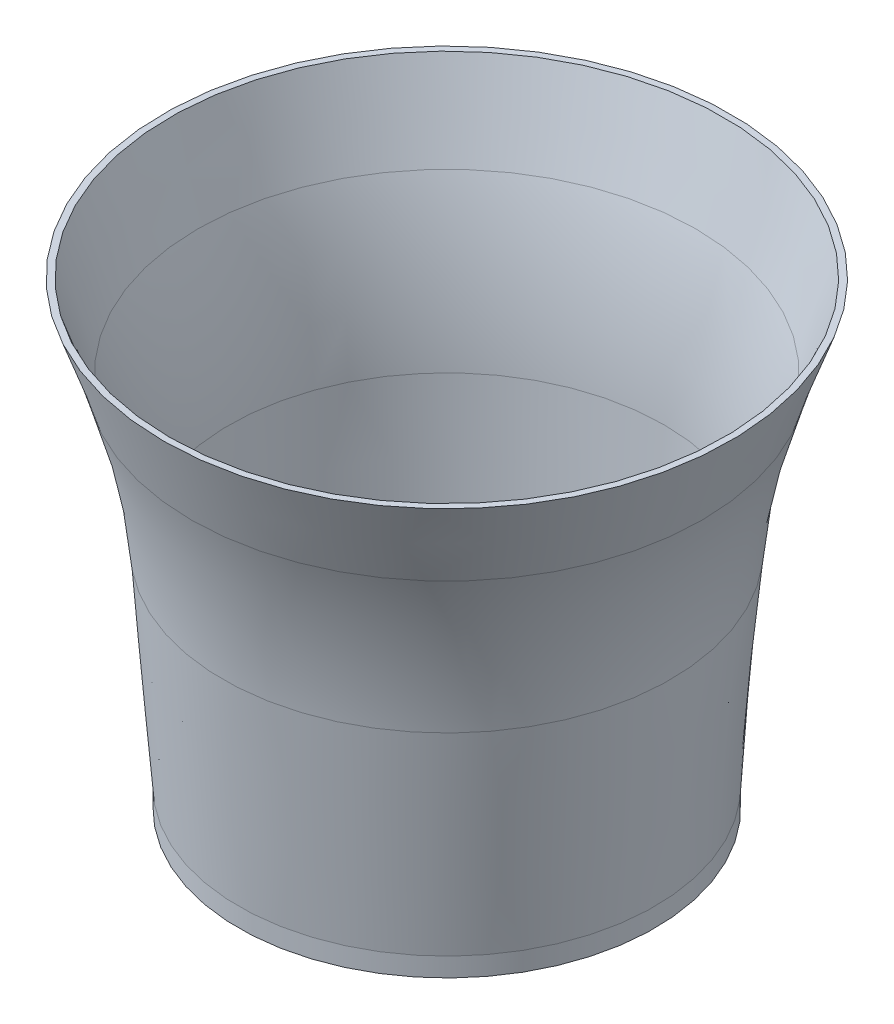
ISO-10303-21;
HEADER;
FILE_DESCRIPTION(('STEP AP214'),'2;1');
FILE_NAME('part.step','',(''),(''),'','','');
FILE_SCHEMA(('AUTOMOTIVE_DESIGN { 1 0 10303 214 1 1 1 1 }'));
ENDSEC;
DATA;
#1=APPLICATION_CONTEXT('core data for automotive mechanical design processes');
#2=APPLICATION_PROTOCOL_DEFINITION('international standard','automotive_design',2000,#1);
#3=PRODUCT_CONTEXT('',#1,'mechanical');
#4=PRODUCT('Part','Part','',(#3));
#5=PRODUCT_RELATED_PRODUCT_CATEGORY('part','',(#4));
#6=PRODUCT_DEFINITION_FORMATION('','',#4);
#7=PRODUCT_DEFINITION_CONTEXT('part definition',#1,'design');
#8=PRODUCT_DEFINITION('design','',#6,#7);
#9=PRODUCT_DEFINITION_SHAPE('','',#8);
#10=(LENGTH_UNIT() NAMED_UNIT(*) SI_UNIT(.MILLI.,.METRE.));
#11=(NAMED_UNIT(*) PLANE_ANGLE_UNIT() SI_UNIT($,.RADIAN.));
#12=(NAMED_UNIT(*) SI_UNIT($,.STERADIAN.) SOLID_ANGLE_UNIT());
#13=UNCERTAINTY_MEASURE_WITH_UNIT(LENGTH_MEASURE(1.E-05),#10,'distance_accuracy_value','');
#14=(GEOMETRIC_REPRESENTATION_CONTEXT(3) GLOBAL_UNCERTAINTY_ASSIGNED_CONTEXT((#13)) GLOBAL_UNIT_ASSIGNED_CONTEXT((#10,
#11,#12)) REPRESENTATION_CONTEXT('',''));
#15=CARTESIAN_POINT('',(0.,0.,0.));
#16=DIRECTION('',(0.,0.,1.));
#17=DIRECTION('',(1.,0.,0.));
#18=AXIS2_PLACEMENT_3D('',#15,#16,#17);
#19=CARTESIAN_POINT('',(0.,-3.,10.));
#20=DIRECTION('',(0.,1.,0.));
#21=DIRECTION('',(0.,0.,1.));
#22=AXIS2_PLACEMENT_3D('',#19,#20,#21);
#23=CYLINDRICAL_SURFACE('',#22,2.);
#24=CARTESIAN_POINT('',(0.,-3.,10.));
#25=DIRECTION('',(0.,-1.,0.));
#26=DIRECTION('',(0.,0.,-1.));
#27=AXIS2_PLACEMENT_3D('',#24,#25,#26);
#28=CIRCLE('',#27,2.);
#29=CARTESIAN_POINT('',(0.,-3.,8.));
#30=VERTEX_POINT('',#29);
#31=EDGE_CURVE('E279',#30,#30,#28,.T.);
#32=ORIENTED_EDGE('',*,*,#31,.T.);
#33=EDGE_LOOP('',(#32));
#34=FACE_BOUND('',#33,.T.);
#35=CARTESIAN_POINT('',(0.,2.,10.));
#36=DIRECTION('',(0.,1.,0.));
#37=DIRECTION('',(0.,0.,1.));
#38=AXIS2_PLACEMENT_3D('',#35,#36,#37);
#39=CIRCLE('',#38,2.);
#40=CARTESIAN_POINT('',(0.,2.,12.));
#41=VERTEX_POINT('',#40);
#42=EDGE_CURVE('E43',#41,#41,#39,.T.);
#43=ORIENTED_EDGE('',*,*,#42,.T.);
#44=EDGE_LOOP('',(#43));
#45=FACE_BOUND('',#44,.T.);
#46=ADVANCED_FACE('F39',(#34,#45),#23,.F.);
#47=CARTESIAN_POINT('',(0.,-3.,-5.));
#48=DIRECTION('',(0.,1.,0.));
#49=DIRECTION('',(0.,0.,1.));
#50=AXIS2_PLACEMENT_3D('',#47,#48,#49);
#51=CYLINDRICAL_SURFACE('',#50,2.);
#52=CARTESIAN_POINT('',(0.,-3.,-5.));
#53=DIRECTION('',(0.,-1.,0.));
#54=DIRECTION('',(0.,0.,-1.));
#55=AXIS2_PLACEMENT_3D('',#52,#53,#54);
#56=CIRCLE('',#55,2.);
#57=CARTESIAN_POINT('',(0.,-3.,-7.));
#58=VERTEX_POINT('',#57);
#59=EDGE_CURVE('E274',#58,#58,#56,.T.);
#60=ORIENTED_EDGE('',*,*,#59,.T.);
#61=EDGE_LOOP('',(#60));
#62=FACE_BOUND('',#61,.T.);
#63=CARTESIAN_POINT('',(0.,2.,-5.));
#64=DIRECTION('',(0.,1.,0.));
#65=DIRECTION('',(0.,0.,1.));
#66=AXIS2_PLACEMENT_3D('',#63,#64,#65);
#67=CIRCLE('',#66,2.);
#68=CARTESIAN_POINT('',(0.,2.,-3.));
#69=VERTEX_POINT('',#68);
#70=EDGE_CURVE('E171',#69,#69,#67,.T.);
#71=ORIENTED_EDGE('',*,*,#70,.T.);
#72=EDGE_LOOP('',(#71));
#73=FACE_BOUND('',#72,.T.);
#74=ADVANCED_FACE('F263',(#62,#73),#51,.F.);
#75=CARTESIAN_POINT('',(0.,0.,0.));
#76=DIRECTION('',(0.,-1.,0.));
#77=DIRECTION('',(0.,0.,-1.));
#78=AXIS2_PLACEMENT_3D('',#75,#76,#77);
#79=PLANE('',#78);
#80=CARTESIAN_POINT('',(0.,0.,0.));
#81=DIRECTION('',(0.,-1.,0.));
#82=DIRECTION('',(0.,0.,-1.));
#83=AXIS2_PLACEMENT_3D('',#80,#81,#82);
#84=CIRCLE('',#83,32.);
#85=CARTESIAN_POINT('',(0.,0.,-32.));
#86=VERTEX_POINT('',#85);
#87=CARTESIAN_POINT('',(32.,0.,-9.05575832015686E-13));
#88=VERTEX_POINT('',#87);
#89=EDGE_CURVE('E290',#86,#88,#84,.T.);
#90=ORIENTED_EDGE('',*,*,#89,.F.);
#91=CARTESIAN_POINT('',(0.,0.,-29.6591143121495));
#92=DIRECTION('',(0.,-1.,0.));
#93=DIRECTION('',(0.,0.,-1.));
#94=AXIS2_PLACEMENT_3D('',#91,#92,#93);
#95=CIRCLE('',#94,2.34088568784921);
#96=CARTESIAN_POINT('',(0.870766699667161,0.,-27.4862104582416));
#97=VERTEX_POINT('',#96);
#98=EDGE_CURVE('E224',#86,#97,#95,.T.);
#99=ORIENTED_EDGE('',*,*,#98,.T.);
#100=CARTESIAN_POINT('',(0.,0.,0.));
#101=DIRECTION('',(0.,-1.,0.));
#102=DIRECTION('',(0.,0.,-1.));
#103=AXIS2_PLACEMENT_3D('',#100,#101,#102);
#104=CIRCLE('',#103,27.5);
#105=CARTESIAN_POINT('',(27.4862104582416,0.,-0.870766699667734));
#106=VERTEX_POINT('',#105);
#107=EDGE_CURVE('E138',#97,#106,#104,.T.);
#108=ORIENTED_EDGE('',*,*,#107,.T.);
#109=CARTESIAN_POINT('',(29.6591143121504,0.,-8.39330535002309E-13));
#110=DIRECTION('',(0.,-1.,0.));
#111=DIRECTION('',(0.,0.,-1.));
#112=AXIS2_PLACEMENT_3D('',#109,#110,#111);
#113=CIRCLE('',#112,2.34088568784986);
#114=EDGE_CURVE('E216',#106,#88,#113,.T.);
#115=ORIENTED_EDGE('',*,*,#114,.T.);
#116=EDGE_LOOP('',(#90,#99,#108,#115));
#117=FACE_BOUND('',#116,.T.);
#118=ADVANCED_FACE('F323',(#117),#79,.F.);
#119=CARTESIAN_POINT('',(1.81115166403142E-12,0.,32.));
#120=VERTEX_POINT('',#119);
#121=EDGE_CURVE('E293',#88,#120,#84,.T.);
#122=ORIENTED_EDGE('',*,*,#121,.F.);
#123=CARTESIAN_POINT('',(27.4862104582416,0.,0.870766699666174));
#124=VERTEX_POINT('',#123);
#125=EDGE_CURVE('E219',#88,#124,#113,.T.);
#126=ORIENTED_EDGE('',*,*,#125,.T.);
#127=CARTESIAN_POINT('',(0.870766699673302,0.,27.4862104582414));
#128=VERTEX_POINT('',#127);
#129=EDGE_CURVE('E143',#124,#128,#104,.T.);
#130=ORIENTED_EDGE('',*,*,#129,.T.);
#131=CARTESIAN_POINT('',(1.67866107000462E-12,0.,29.6591143121495));
#132=DIRECTION('',(0.,-1.,0.));
#133=DIRECTION('',(0.,0.,-1.));
#134=AXIS2_PLACEMENT_3D('',#131,#132,#133);
#135=CIRCLE('',#134,2.34088568785101);
#136=EDGE_CURVE('E212',#128,#120,#135,.T.);
#137=ORIENTED_EDGE('',*,*,#136,.T.);
#138=EDGE_LOOP('',(#122,#126,#130,#137));
#139=FACE_BOUND('',#138,.T.);
#140=ADVANCED_FACE('F471',(#139),#79,.F.);
#141=CARTESIAN_POINT('',(-27.4862104582415,0.,-0.870766699671817));
#142=VERTEX_POINT('',#141);
#143=CARTESIAN_POINT('',(-0.870766699667165,0.,-27.4862104582416));
#144=VERTEX_POINT('',#143);
#145=EDGE_CURVE('E132',#142,#144,#104,.T.);
#146=ORIENTED_EDGE('',*,*,#145,.T.);
#147=EDGE_CURVE('E222',#144,#86,#95,.T.);
#148=ORIENTED_EDGE('',*,*,#147,.T.);
#149=CARTESIAN_POINT('',(-32.,0.,9.09494701773009E-13));
#150=VERTEX_POINT('',#149);
#151=EDGE_CURVE('E285',#150,#86,#84,.T.);
#152=ORIENTED_EDGE('',*,*,#151,.F.);
#153=CARTESIAN_POINT('',(-29.6591143121487,0.,8.42962728943101E-13));
#154=DIRECTION('',(0.,-1.,0.));
#155=DIRECTION('',(0.,0.,-1.));
#156=AXIS2_PLACEMENT_3D('',#153,#154,#155);
#157=CIRCLE('',#156,2.34088568785055);
#158=EDGE_CURVE('E133',#150,#142,#157,.T.);
#159=ORIENTED_EDGE('',*,*,#158,.T.);
#160=EDGE_LOOP('',(#146,#148,#152,#159));
#161=FACE_BOUND('',#160,.T.);
#162=ADVANCED_FACE('F336',(#161),#79,.F.);
#163=CARTESIAN_POINT('',(0.,5.,0.));
#164=DIRECTION('',(0.,-1.,0.));
#165=DIRECTION('',(0.,0.,-1.));
#166=AXIS2_PLACEMENT_3D('',#163,#164,#165);
#167=CYLINDRICAL_SURFACE('',#166,27.5);
#168=DIRECTION('',(0.,1.,0.));
#169=VECTOR('',#168,1.);
#170=CARTESIAN_POINT('',(0.870766699667159,33.50005,-27.4862104582416));
#171=LINE('',#170,#169);
#172=CARTESIAN_POINT('',(0.87076669966714,5.,-27.4862104582416));
#173=VERTEX_POINT('',#172);
#174=EDGE_CURVE('E221',#173,#97,#171,.F.);
#175=ORIENTED_EDGE('',*,*,#174,.F.);
#176=CARTESIAN_POINT('',(0.,5.,0.));
#177=DIRECTION('',(0.,-1.,0.));
#178=DIRECTION('',(0.,0.,-1.));
#179=AXIS2_PLACEMENT_3D('',#176,#177,#178);
#180=CIRCLE('',#179,27.5);
#181=CARTESIAN_POINT('',(27.4862104582416,5.,-0.870766699667731));
#182=VERTEX_POINT('',#181);
#183=EDGE_CURVE('E140',#173,#182,#180,.T.);
#184=ORIENTED_EDGE('',*,*,#183,.T.);
#185=DIRECTION('',(0.,1.,0.));
#186=VECTOR('',#185,1.);
#187=CARTESIAN_POINT('',(27.4862104582416,33.50005,-0.870766699667733));
#188=LINE('',#187,#186);
#189=EDGE_CURVE('E213',#106,#182,#188,.T.);
#190=ORIENTED_EDGE('',*,*,#189,.F.);
#191=ORIENTED_EDGE('',*,*,#107,.F.);
#192=EDGE_LOOP('',(#175,#184,#190,#191));
#193=FACE_BOUND('',#192,.T.);
#194=ADVANCED_FACE('F315',(#193),#167,.T.);
#195=DIRECTION('',(0.,1.,0.));
#196=VECTOR('',#195,1.);
#197=CARTESIAN_POINT('',(27.4862104582416,33.50005,0.870766699666177));
#198=LINE('',#197,#196);
#199=CARTESIAN_POINT('',(27.4862104582417,5.,0.870766699666175));
#200=VERTEX_POINT('',#199);
#201=EDGE_CURVE('E163',#200,#124,#198,.F.);
#202=ORIENTED_EDGE('',*,*,#201,.F.);
#203=CARTESIAN_POINT('',(0.870766699673303,5.,27.4862104582414));
#204=VERTEX_POINT('',#203);
#205=EDGE_CURVE('E141',#200,#204,#180,.T.);
#206=ORIENTED_EDGE('',*,*,#205,.T.);
#207=DIRECTION('',(0.,1.,0.));
#208=VECTOR('',#207,1.);
#209=CARTESIAN_POINT('',(0.870766699673305,33.50005,27.4862104582414));
#210=LINE('',#209,#208);
#211=EDGE_CURVE('E161',#128,#204,#210,.T.);
#212=ORIENTED_EDGE('',*,*,#211,.F.);
#213=ORIENTED_EDGE('',*,*,#129,.F.);
#214=EDGE_LOOP('',(#202,#206,#212,#213));
#215=FACE_BOUND('',#214,.T.);
#216=ADVANCED_FACE('F159',(#215),#167,.T.);
#217=DIRECTION('',(0.,1.,0.));
#218=VECTOR('',#217,1.);
#219=CARTESIAN_POINT('',(-0.870766699670193,33.50005,27.4862104582415));
#220=LINE('',#219,#218);
#221=CARTESIAN_POINT('',(-0.870766699670191,5.,27.4862104582415));
#222=VERTEX_POINT('',#221);
#223=CARTESIAN_POINT('',(-0.870766699670182,0.,27.4862104582415));
#224=VERTEX_POINT('',#223);
#225=EDGE_CURVE('E207',#222,#224,#220,.F.);
#226=ORIENTED_EDGE('',*,*,#225,.F.);
#227=CARTESIAN_POINT('',(-27.4862104582414,5.,0.8707666996734));
#228=VERTEX_POINT('',#227);
#229=EDGE_CURVE('E137',#222,#228,#180,.T.);
#230=ORIENTED_EDGE('',*,*,#229,.T.);
#231=DIRECTION('',(0.,1.,0.));
#232=VECTOR('',#231,1.);
#233=CARTESIAN_POINT('',(-27.4862104582414,33.50005,0.870766699673392));
#234=LINE('',#233,#232);
#235=CARTESIAN_POINT('',(-27.4862104582414,0.,0.870766699673389));
#236=VERTEX_POINT('',#235);
#237=EDGE_CURVE('E63',#236,#228,#234,.T.);
#238=ORIENTED_EDGE('',*,*,#237,.F.);
#239=EDGE_CURVE('E232',#224,#236,#104,.T.);
#240=ORIENTED_EDGE('',*,*,#239,.F.);
#241=EDGE_LOOP('',(#226,#230,#238,#240));
#242=FACE_BOUND('',#241,.T.);
#243=ADVANCED_FACE('F316',(#242),#167,.T.);
#244=CARTESIAN_POINT('',(0.,45.,0.));
#245=DIRECTION('',(0.,1.,0.));
#246=DIRECTION('',(0.,0.,1.));
#247=AXIS2_PLACEMENT_3D('',#244,#245,#246);
#248=CONICAL_SURFACE('',#247,36.5,0.0776215087373936);
#249=CARTESIAN_POINT('',(0.,32.4663971508259,0.));
#250=DIRECTION('',(0.,-1.,0.));
#251=DIRECTION('',(0.,0.,-1.));
#252=AXIS2_PLACEMENT_3D('',#249,#250,#251);
#253=CIRCLE('',#252,35.525164222842);
#254=CARTESIAN_POINT('',(0.,32.4663971508259,-35.525164222842));
#255=VERTEX_POINT('',#254);
#256=EDGE_CURVE('E124',#255,#255,#253,.T.);
#257=ORIENTED_EDGE('',*,*,#256,.T.);
#258=EDGE_LOOP('',(#257));
#259=FACE_BOUND('',#258,.T.);
#260=CARTESIAN_POINT('',(0.,0.,0.));
#261=DIRECTION('',(0.,-1.,0.));
#262=DIRECTION('',(0.,0.,-1.));
#263=AXIS2_PLACEMENT_3D('',#260,#261,#262);
#264=CIRCLE('',#263,33.);
#265=CARTESIAN_POINT('',(0.,0.,-33.));
#266=VERTEX_POINT('',#265);
#267=EDGE_CURVE('E286',#266,#266,#264,.T.);
#268=ORIENTED_EDGE('',*,*,#267,.F.);
#269=EDGE_LOOP('',(#268));
#270=FACE_BOUND('',#269,.T.);
#271=ADVANCED_FACE('F304',(#259,#270),#248,.T.);
#272=CARTESIAN_POINT('',(0.,0.,0.));
#273=DIRECTION('',(0.,1.,0.));
#274=DIRECTION('',(0.,0.,1.));
#275=AXIS2_PLACEMENT_3D('',#272,#273,#274);
#276=CONICAL_SURFACE('',#275,32.,0.0776215087373934);
#277=CARTESIAN_POINT('',(0.,32.4663971508262,0.));
#278=DIRECTION('',(0.,-1.,0.));
#279=DIRECTION('',(0.,0.,-1.));
#280=AXIS2_PLACEMENT_3D('',#277,#278,#279);
#281=CIRCLE('',#280,34.525164222842);
#282=CARTESIAN_POINT('',(0.,32.4663971508262,-34.525164222842));
#283=VERTEX_POINT('',#282);
#284=EDGE_CURVE('E289',#283,#283,#281,.F.);
#285=ORIENTED_EDGE('',*,*,#284,.T.);
#286=EDGE_LOOP('',(#285));
#287=FACE_BOUND('',#286,.T.);
#288=ORIENTED_EDGE('',*,*,#89,.T.);
#289=ORIENTED_EDGE('',*,*,#121,.T.);
#290=EDGE_CURVE('E540',#120,#150,#84,.T.);
#291=ORIENTED_EDGE('',*,*,#290,.T.);
#292=ORIENTED_EDGE('',*,*,#151,.T.);
#293=EDGE_LOOP('',(#288,#289,#291,#292));
#294=FACE_BOUND('',#293,.T.);
#295=ADVANCED_FACE('F334',(#287,#294),#276,.F.);
#296=ORIENTED_EDGE('',*,*,#290,.F.);
#297=EDGE_CURVE('E209',#120,#224,#135,.T.);
#298=ORIENTED_EDGE('',*,*,#297,.T.);
#299=ORIENTED_EDGE('',*,*,#239,.T.);
#300=EDGE_CURVE('E205',#236,#150,#157,.T.);
#301=ORIENTED_EDGE('',*,*,#300,.T.);
#302=EDGE_LOOP('',(#296,#298,#299,#301));
#303=FACE_BOUND('',#302,.T.);
#304=ADVANCED_FACE('F330',(#303),#79,.F.);
#305=CARTESIAN_POINT('',(0.,-3.,0.));
#306=DIRECTION('',(0.,-1.,0.));
#307=DIRECTION('',(0.,0.,-1.));
#308=AXIS2_PLACEMENT_3D('',#305,#306,#307);
#309=PLANE('',#308);
#310=CARTESIAN_POINT('',(0.,-3.,-29.6591143121495));
#311=DIRECTION('',(0.,1.,0.));
#312=DIRECTION('',(0.,0.,1.));
#313=AXIS2_PLACEMENT_3D('',#310,#311,#312);
#314=CIRCLE('',#313,2.34088568784921);
#315=CARTESIAN_POINT('',(0.,-3.,-27.3182286243003));
#316=VERTEX_POINT('',#315);
#317=EDGE_CURVE('E192',#316,#316,#314,.T.);
#318=ORIENTED_EDGE('',*,*,#317,.T.);
#319=EDGE_LOOP('',(#318));
#320=FACE_BOUND('',#319,.T.);
#321=CARTESIAN_POINT('',(29.6591143121504,-3.,-8.39330535002309E-13));
#322=DIRECTION('',(0.,1.,0.));
#323=DIRECTION('',(0.,0.,1.));
#324=AXIS2_PLACEMENT_3D('',#321,#322,#323);
#325=CIRCLE('',#324,2.34088568784986);
#326=CARTESIAN_POINT('',(29.6591143121504,-3.,2.34088568784902));
#327=VERTEX_POINT('',#326);
#328=EDGE_CURVE('E195',#327,#327,#325,.T.);
#329=ORIENTED_EDGE('',*,*,#328,.T.);
#330=EDGE_LOOP('',(#329));
#331=FACE_BOUND('',#330,.T.);
#332=CARTESIAN_POINT('',(1.67866107000462E-12,-3.,29.6591143121495));
#333=DIRECTION('',(0.,1.,0.));
#334=DIRECTION('',(0.,0.,1.));
#335=AXIS2_PLACEMENT_3D('',#332,#333,#334);
#336=CIRCLE('',#335,2.34088568785101);
#337=CARTESIAN_POINT('',(1.67866107000462E-12,-3.,32.0000000000005));
#338=VERTEX_POINT('',#337);
#339=EDGE_CURVE('E198',#338,#338,#336,.T.);
#340=ORIENTED_EDGE('',*,*,#339,.T.);
#341=EDGE_LOOP('',(#340));
#342=FACE_BOUND('',#341,.T.);
#343=CARTESIAN_POINT('',(-29.6591143121487,-3.,8.42962728943101E-13));
#344=DIRECTION('',(0.,1.,0.));
#345=DIRECTION('',(0.,0.,1.));
#346=AXIS2_PLACEMENT_3D('',#343,#344,#345);
#347=CIRCLE('',#346,2.34088568785055);
#348=CARTESIAN_POINT('',(-29.6591143121487,-3.,2.3408856878514));
#349=VERTEX_POINT('',#348);
#350=EDGE_CURVE('E177',#349,#349,#347,.T.);
#351=ORIENTED_EDGE('',*,*,#350,.T.);
#352=EDGE_LOOP('',(#351));
#353=FACE_BOUND('',#352,.T.);
#354=ORIENTED_EDGE('',*,*,#31,.F.);
#355=EDGE_LOOP('',(#354));
#356=FACE_BOUND('',#355,.T.);
#357=CARTESIAN_POINT('',(0.,-3.,0.));
#358=DIRECTION('',(0.,-1.,0.));
#359=DIRECTION('',(0.,0.,-1.));
#360=AXIS2_PLACEMENT_3D('',#357,#358,#359);
#361=CIRCLE('',#360,33.);
#362=CARTESIAN_POINT('',(0.,-3.,-33.));
#363=VERTEX_POINT('',#362);
#364=EDGE_CURVE('E282',#363,#363,#361,.T.);
#365=ORIENTED_EDGE('',*,*,#364,.T.);
#366=EDGE_LOOP('',(#365));
#367=FACE_BOUND('',#366,.T.);
#368=ORIENTED_EDGE('',*,*,#59,.F.);
#369=EDGE_LOOP('',(#368));
#370=FACE_BOUND('',#369,.T.);
#371=ADVANCED_FACE('F327',(#320,#331,#342,#353,#356,#367,#370),#309,.T.);
#372=CARTESIAN_POINT('',(0.,-3.,0.));
#373=DIRECTION('',(0.,1.,0.));
#374=DIRECTION('',(0.,0.,1.));
#375=AXIS2_PLACEMENT_3D('',#372,#373,#374);
#376=CYLINDRICAL_SURFACE('',#375,33.);
#377=ORIENTED_EDGE('',*,*,#364,.F.);
#378=EDGE_LOOP('',(#377));
#379=FACE_BOUND('',#378,.T.);
#380=ORIENTED_EDGE('',*,*,#267,.T.);
#381=EDGE_LOOP('',(#380));
#382=FACE_BOUND('',#381,.T.);
#383=ADVANCED_FACE('F261',(#379,#382),#376,.T.);
#384=CARTESIAN_POINT('',(0.,70.,0.));
#385=DIRECTION('',(0.,1.,0.));
#386=DIRECTION('',(0.,0.,1.));
#387=AXIS2_PLACEMENT_3D('',#384,#385,#386);
#388=PLANE('',#387);
#389=CARTESIAN_POINT('',(0.,70.,0.));
#390=DIRECTION('',(0.,1.,0.));
#391=DIRECTION('',(0.,0.,1.));
#392=AXIS2_PLACEMENT_3D('',#389,#390,#391);
#393=CIRCLE('',#392,44.);
#394=CARTESIAN_POINT('',(0.,70.,44.));
#395=VERTEX_POINT('',#394);
#396=EDGE_CURVE('E147',#395,#395,#393,.T.);
#397=ORIENTED_EDGE('',*,*,#396,.F.);
#398=EDGE_LOOP('',(#397));
#399=FACE_BOUND('',#398,.T.);
#400=CARTESIAN_POINT('',(0.,70.,0.));
#401=DIRECTION('',(0.,1.,0.));
#402=DIRECTION('',(0.,0.,1.));
#403=AXIS2_PLACEMENT_3D('',#400,#401,#402);
#404=CIRCLE('',#403,45.);
#405=CARTESIAN_POINT('',(0.,70.,45.));
#406=VERTEX_POINT('',#405);
#407=EDGE_CURVE('E152',#406,#406,#404,.T.);
#408=ORIENTED_EDGE('',*,*,#407,.T.);
#409=EDGE_LOOP('',(#408));
#410=FACE_BOUND('',#409,.T.);
#411=ADVANCED_FACE('F255',(#399,#410),#388,.T.);
#412=CARTESIAN_POINT('',(0.,45.,0.));
#413=DIRECTION('',(0.,1.,0.));
#414=DIRECTION('',(0.,0.,1.));
#415=AXIS2_PLACEMENT_3D('',#412,#413,#414);
#416=CONICAL_SURFACE('',#415,36.5,0.327738506780556);
#417=CARTESIAN_POINT('',(0.,56.9023118738769,0.));
#418=DIRECTION('',(0.,-1.,0.));
#419=DIRECTION('',(0.,0.,-1.));
#420=AXIS2_PLACEMENT_3D('',#417,#418,#419);
#421=CIRCLE('',#420,40.5467860371182);
#422=CARTESIAN_POINT('',(0.,56.9023118738769,-40.5467860371182));
#423=VERTEX_POINT('',#422);
#424=EDGE_CURVE('E299',#423,#423,#421,.F.);
#425=ORIENTED_EDGE('',*,*,#424,.T.);
#426=EDGE_LOOP('',(#425));
#427=FACE_BOUND('',#426,.T.);
#428=ORIENTED_EDGE('',*,*,#407,.F.);
#429=EDGE_LOOP('',(#428));
#430=FACE_BOUND('',#429,.T.);
#431=ADVANCED_FACE('F244',(#427,#430),#416,.T.);
#432=CARTESIAN_POINT('',(0.,45.,0.));
#433=DIRECTION('',(0.,1.,0.));
#434=DIRECTION('',(0.,0.,1.));
#435=AXIS2_PLACEMENT_3D('',#432,#433,#434);
#436=CONICAL_SURFACE('',#435,35.5,0.327738506780555);
#437=CARTESIAN_POINT('',(0.,56.9023118738771,0.));
#438=DIRECTION('',(0.,-1.,0.));
#439=DIRECTION('',(0.,0.,-1.));
#440=AXIS2_PLACEMENT_3D('',#437,#438,#439);
#441=CIRCLE('',#440,39.5467860371182);
#442=CARTESIAN_POINT('',(0.,56.9023118738771,-39.5467860371182));
#443=VERTEX_POINT('',#442);
#444=EDGE_CURVE('E296',#443,#443,#441,.T.);
#445=ORIENTED_EDGE('',*,*,#444,.T.);
#446=EDGE_LOOP('',(#445));
#447=FACE_BOUND('',#446,.T.);
#448=ORIENTED_EDGE('',*,*,#396,.T.);
#449=EDGE_LOOP('',(#448));
#450=FACE_BOUND('',#449,.T.);
#451=ADVANCED_FACE('F254',(#447,#450),#436,.F.);
#452=CARTESIAN_POINT('',(0.,24.7120385500068,0.));
#453=DIRECTION('',(0.,-1.,0.));
#454=DIRECTION('',(0.,0.,-1.));
#455=AXIS2_PLACEMENT_3D('',#452,#453,#454);
#456=TOROIDAL_SURFACE('',#455,134.224060519089,100.);
#457=ORIENTED_EDGE('',*,*,#444,.F.);
#458=EDGE_LOOP('',(#457));
#459=FACE_BOUND('',#458,.T.);
#460=ORIENTED_EDGE('',*,*,#284,.F.);
#461=EDGE_LOOP('',(#460));
#462=FACE_BOUND('',#461,.T.);
#463=ADVANCED_FACE('F309',(#459,#462),#456,.T.);
#464=CARTESIAN_POINT('',(0.,24.7120385500067,0.));
#465=DIRECTION('',(0.,1.,0.));
#466=DIRECTION('',(0.,0.,1.));
#467=AXIS2_PLACEMENT_3D('',#464,#465,#466);
#468=TOROIDAL_SURFACE('',#467,135.224060519089,100.);
#469=ORIENTED_EDGE('',*,*,#256,.F.);
#470=EDGE_LOOP('',(#469));
#471=FACE_BOUND('',#470,.T.);
#472=ORIENTED_EDGE('',*,*,#424,.F.);
#473=EDGE_LOOP('',(#472));
#474=FACE_BOUND('',#473,.T.);
#475=ADVANCED_FACE('F41',(#471,#474),#468,.F.);
#476=DIRECTION('',(0.,1.,0.));
#477=VECTOR('',#476,1.);
#478=CARTESIAN_POINT('',(-0.870766699667159,33.50005,-27.4862104582416));
#479=LINE('',#478,#477);
#480=CARTESIAN_POINT('',(-0.87076669966714,5.,-27.4862104582416));
#481=VERTEX_POINT('',#480);
#482=EDGE_CURVE('E56',#144,#481,#479,.T.);
#483=ORIENTED_EDGE('',*,*,#482,.F.);
#484=ORIENTED_EDGE('',*,*,#145,.F.);
#485=DIRECTION('',(0.,1.,0.));
#486=VECTOR('',#485,1.);
#487=CARTESIAN_POINT('',(-27.4862104582415,33.50005,-0.870766699671829));
#488=LINE('',#487,#486);
#489=CARTESIAN_POINT('',(-27.4862104582415,5.,-0.870766699671837));
#490=VERTEX_POINT('',#489);
#491=EDGE_CURVE('E117',#490,#142,#488,.F.);
#492=ORIENTED_EDGE('',*,*,#491,.F.);
#493=EDGE_CURVE('E130',#490,#481,#180,.T.);
#494=ORIENTED_EDGE('',*,*,#493,.T.);
#495=EDGE_LOOP('',(#483,#484,#492,#494));
#496=FACE_BOUND('',#495,.T.);
#497=ADVANCED_FACE('F129',(#496),#167,.T.);
#498=CARTESIAN_POINT('',(0.,5.,0.));
#499=DIRECTION('',(0.,-1.,0.));
#500=DIRECTION('',(0.,0.,-1.));
#501=AXIS2_PLACEMENT_3D('',#498,#499,#500);
#502=PLANE('',#501);
#503=CARTESIAN_POINT('',(0.,5.,-5.));
#504=DIRECTION('',(0.,1.,0.));
#505=DIRECTION('',(0.,0.,1.));
#506=AXIS2_PLACEMENT_3D('',#503,#504,#505);
#507=CIRCLE('',#506,4.);
#508=CARTESIAN_POINT('',(0.,5.,-1.));
#509=VERTEX_POINT('',#508);
#510=EDGE_CURVE('E179',#509,#509,#507,.T.);
#511=ORIENTED_EDGE('',*,*,#510,.F.);
#512=EDGE_LOOP('',(#511));
#513=FACE_BOUND('',#512,.T.);
#514=CARTESIAN_POINT('',(0.,5.,10.));
#515=DIRECTION('',(0.,1.,0.));
#516=DIRECTION('',(0.,0.,1.));
#517=AXIS2_PLACEMENT_3D('',#514,#515,#516);
#518=CIRCLE('',#517,4.);
#519=CARTESIAN_POINT('',(0.,5.,14.));
#520=VERTEX_POINT('',#519);
#521=EDGE_CURVE('E189',#520,#520,#518,.T.);
#522=ORIENTED_EDGE('',*,*,#521,.F.);
#523=EDGE_LOOP('',(#522));
#524=FACE_BOUND('',#523,.T.);
#525=ORIENTED_EDGE('',*,*,#183,.F.);
#526=CARTESIAN_POINT('',(0.,5.,-29.6591143121495));
#527=DIRECTION('',(0.,-1.,0.));
#528=DIRECTION('',(0.,0.,-1.));
#529=AXIS2_PLACEMENT_3D('',#526,#527,#528);
#530=CIRCLE('',#529,2.34088568784921);
#531=EDGE_CURVE('E12',#173,#481,#530,.T.);
#532=ORIENTED_EDGE('',*,*,#531,.T.);
#533=ORIENTED_EDGE('',*,*,#493,.F.);
#534=CARTESIAN_POINT('',(-29.6591143121487,5.,8.42962728943101E-13));
#535=DIRECTION('',(0.,-1.,0.));
#536=DIRECTION('',(0.,0.,-1.));
#537=AXIS2_PLACEMENT_3D('',#534,#535,#536);
#538=CIRCLE('',#537,2.34088568785055);
#539=EDGE_CURVE('E114',#490,#228,#538,.T.);
#540=ORIENTED_EDGE('',*,*,#539,.T.);
#541=ORIENTED_EDGE('',*,*,#229,.F.);
#542=CARTESIAN_POINT('',(1.67866107000462E-12,5.,29.6591143121495));
#543=DIRECTION('',(0.,-1.,0.));
#544=DIRECTION('',(0.,0.,-1.));
#545=AXIS2_PLACEMENT_3D('',#542,#543,#544);
#546=CIRCLE('',#545,2.34088568785101);
#547=EDGE_CURVE('E123',#222,#204,#546,.T.);
#548=ORIENTED_EDGE('',*,*,#547,.T.);
#549=ORIENTED_EDGE('',*,*,#205,.F.);
#550=CARTESIAN_POINT('',(29.6591143121504,5.,-8.39330535002309E-13));
#551=DIRECTION('',(0.,-1.,0.));
#552=DIRECTION('',(0.,0.,-1.));
#553=AXIS2_PLACEMENT_3D('',#550,#551,#552);
#554=CIRCLE('',#553,2.34088568784986);
#555=EDGE_CURVE('E48',#200,#182,#554,.T.);
#556=ORIENTED_EDGE('',*,*,#555,.T.);
#557=EDGE_LOOP('',(#525,#532,#533,#540,#541,#548,#549,#556));
#558=FACE_BOUND('',#557,.T.);
#559=ADVANCED_FACE('F136',(#513,#524,#558),#502,.F.);
#560=CARTESIAN_POINT('',(-29.6591143121487,-3.,8.42962728943101E-13));
#561=DIRECTION('',(0.,1.,0.));
#562=DIRECTION('',(0.,0.,1.));
#563=AXIS2_PLACEMENT_3D('',#560,#561,#562);
#564=CYLINDRICAL_SURFACE('',#563,2.34088568785055);
#565=ORIENTED_EDGE('',*,*,#350,.F.);
#566=EDGE_LOOP('',(#565));
#567=FACE_BOUND('',#566,.T.);
#568=ORIENTED_EDGE('',*,*,#237,.T.);
#569=ORIENTED_EDGE('',*,*,#539,.F.);
#570=ORIENTED_EDGE('',*,*,#491,.T.);
#571=ORIENTED_EDGE('',*,*,#158,.F.);
#572=ORIENTED_EDGE('',*,*,#300,.F.);
#573=EDGE_LOOP('',(#568,#569,#570,#571,#572));
#574=FACE_BOUND('',#573,.T.);
#575=ADVANCED_FACE('F116',(#567,#574),#564,.F.);
#576=CARTESIAN_POINT('',(1.67866107000462E-12,-3.,29.6591143121495));
#577=DIRECTION('',(0.,1.,0.));
#578=DIRECTION('',(0.,0.,1.));
#579=AXIS2_PLACEMENT_3D('',#576,#577,#578);
#580=CYLINDRICAL_SURFACE('',#579,2.34088568785101);
#581=ORIENTED_EDGE('',*,*,#339,.F.);
#582=EDGE_LOOP('',(#581));
#583=FACE_BOUND('',#582,.T.);
#584=ORIENTED_EDGE('',*,*,#211,.T.);
#585=ORIENTED_EDGE('',*,*,#547,.F.);
#586=ORIENTED_EDGE('',*,*,#225,.T.);
#587=ORIENTED_EDGE('',*,*,#297,.F.);
#588=ORIENTED_EDGE('',*,*,#136,.F.);
#589=EDGE_LOOP('',(#584,#585,#586,#587,#588));
#590=FACE_BOUND('',#589,.T.);
#591=ADVANCED_FACE('F357',(#583,#590),#580,.F.);
#592=CARTESIAN_POINT('',(29.6591143121504,-3.,-8.39330535002309E-13));
#593=DIRECTION('',(0.,1.,0.));
#594=DIRECTION('',(0.,0.,1.));
#595=AXIS2_PLACEMENT_3D('',#592,#593,#594);
#596=CYLINDRICAL_SURFACE('',#595,2.34088568784986);
#597=ORIENTED_EDGE('',*,*,#328,.F.);
#598=EDGE_LOOP('',(#597));
#599=FACE_BOUND('',#598,.T.);
#600=ORIENTED_EDGE('',*,*,#114,.F.);
#601=ORIENTED_EDGE('',*,*,#189,.T.);
#602=ORIENTED_EDGE('',*,*,#555,.F.);
#603=ORIENTED_EDGE('',*,*,#201,.T.);
#604=ORIENTED_EDGE('',*,*,#125,.F.);
#605=EDGE_LOOP('',(#600,#601,#602,#603,#604));
#606=FACE_BOUND('',#605,.T.);
#607=ADVANCED_FACE('F361',(#599,#606),#596,.F.);
#608=CARTESIAN_POINT('',(0.,-3.,-29.6591143121495));
#609=DIRECTION('',(0.,1.,0.));
#610=DIRECTION('',(0.,0.,1.));
#611=AXIS2_PLACEMENT_3D('',#608,#609,#610);
#612=CYLINDRICAL_SURFACE('',#611,2.34088568784921);
#613=ORIENTED_EDGE('',*,*,#317,.F.);
#614=EDGE_LOOP('',(#613));
#615=FACE_BOUND('',#614,.T.);
#616=ORIENTED_EDGE('',*,*,#147,.F.);
#617=ORIENTED_EDGE('',*,*,#482,.T.);
#618=ORIENTED_EDGE('',*,*,#531,.F.);
#619=ORIENTED_EDGE('',*,*,#174,.T.);
#620=ORIENTED_EDGE('',*,*,#98,.F.);
#621=EDGE_LOOP('',(#616,#617,#618,#619,#620));
#622=FACE_BOUND('',#621,.T.);
#623=ADVANCED_FACE('F365',(#615,#622),#612,.F.);
#624=CARTESIAN_POINT('',(0.,2.,10.));
#625=DIRECTION('',(0.,1.,0.));
#626=DIRECTION('',(0.,0.,1.));
#627=AXIS2_PLACEMENT_3D('',#624,#625,#626);
#628=CYLINDRICAL_SURFACE('',#627,4.);
#629=CARTESIAN_POINT('',(0.,2.,10.));
#630=DIRECTION('',(0.,1.,0.));
#631=DIRECTION('',(0.,0.,1.));
#632=AXIS2_PLACEMENT_3D('',#629,#630,#631);
#633=CIRCLE('',#632,4.);
#634=CARTESIAN_POINT('',(0.,2.,14.));
#635=VERTEX_POINT('',#634);
#636=EDGE_CURVE('E184',#635,#635,#633,.T.);
#637=ORIENTED_EDGE('',*,*,#636,.F.);
#638=EDGE_LOOP('',(#637));
#639=FACE_BOUND('',#638,.T.);
#640=ORIENTED_EDGE('',*,*,#521,.T.);
#641=EDGE_LOOP('',(#640));
#642=FACE_BOUND('',#641,.T.);
#643=ADVANCED_FACE('F369',(#639,#642),#628,.F.);
#644=CARTESIAN_POINT('',(0.,2.,10.));
#645=DIRECTION('',(0.,1.,0.));
#646=DIRECTION('',(0.,0.,1.));
#647=AXIS2_PLACEMENT_3D('',#644,#645,#646);
#648=PLANE('',#647);
#649=ORIENTED_EDGE('',*,*,#42,.F.);
#650=EDGE_LOOP('',(#649));
#651=FACE_BOUND('',#650,.T.);
#652=ORIENTED_EDGE('',*,*,#636,.T.);
#653=EDGE_LOOP('',(#652));
#654=FACE_BOUND('',#653,.T.);
#655=ADVANCED_FACE('F373',(#651,#654),#648,.T.);
#656=CARTESIAN_POINT('',(0.,2.,-5.));
#657=DIRECTION('',(0.,1.,0.));
#658=DIRECTION('',(0.,0.,1.));
#659=AXIS2_PLACEMENT_3D('',#656,#657,#658);
#660=CYLINDRICAL_SURFACE('',#659,4.);
#661=CARTESIAN_POINT('',(0.,2.,-5.));
#662=DIRECTION('',(0.,1.,0.));
#663=DIRECTION('',(0.,0.,1.));
#664=AXIS2_PLACEMENT_3D('',#661,#662,#663);
#665=CIRCLE('',#664,4.);
#666=CARTESIAN_POINT('',(0.,2.,-1.));
#667=VERTEX_POINT('',#666);
#668=EDGE_CURVE('E173',#667,#667,#665,.T.);
#669=ORIENTED_EDGE('',*,*,#668,.F.);
#670=EDGE_LOOP('',(#669));
#671=FACE_BOUND('',#670,.T.);
#672=ORIENTED_EDGE('',*,*,#510,.T.);
#673=EDGE_LOOP('',(#672));
#674=FACE_BOUND('',#673,.T.);
#675=ADVANCED_FACE('F377',(#671,#674),#660,.F.);
#676=CARTESIAN_POINT('',(0.,2.,-5.));
#677=DIRECTION('',(0.,1.,0.));
#678=DIRECTION('',(0.,0.,1.));
#679=AXIS2_PLACEMENT_3D('',#676,#677,#678);
#680=PLANE('',#679);
#681=ORIENTED_EDGE('',*,*,#70,.F.);
#682=EDGE_LOOP('',(#681));
#683=FACE_BOUND('',#682,.T.);
#684=ORIENTED_EDGE('',*,*,#668,.T.);
#685=EDGE_LOOP('',(#684));
#686=FACE_BOUND('',#685,.T.);
#687=ADVANCED_FACE('F381',(#683,#686),#680,.T.);
#688=CLOSED_SHELL('',(#46,#74,#118,#140,#162,#194,#216,#243,#271,#295,#304,#371,#383,#411,#431,
#451,#463,#475,#497,#559,#575,#591,#607,#623,#643,#655,#675,#687));
#689=MANIFOLD_SOLID_BREP('B2',#688);
#690=ADVANCED_BREP_SHAPE_REPRESENTATION('',(#18,#689),#14);
#691=SHAPE_DEFINITION_REPRESENTATION(#9,#690);
ENDSEC;
END-ISO-10303-21;
